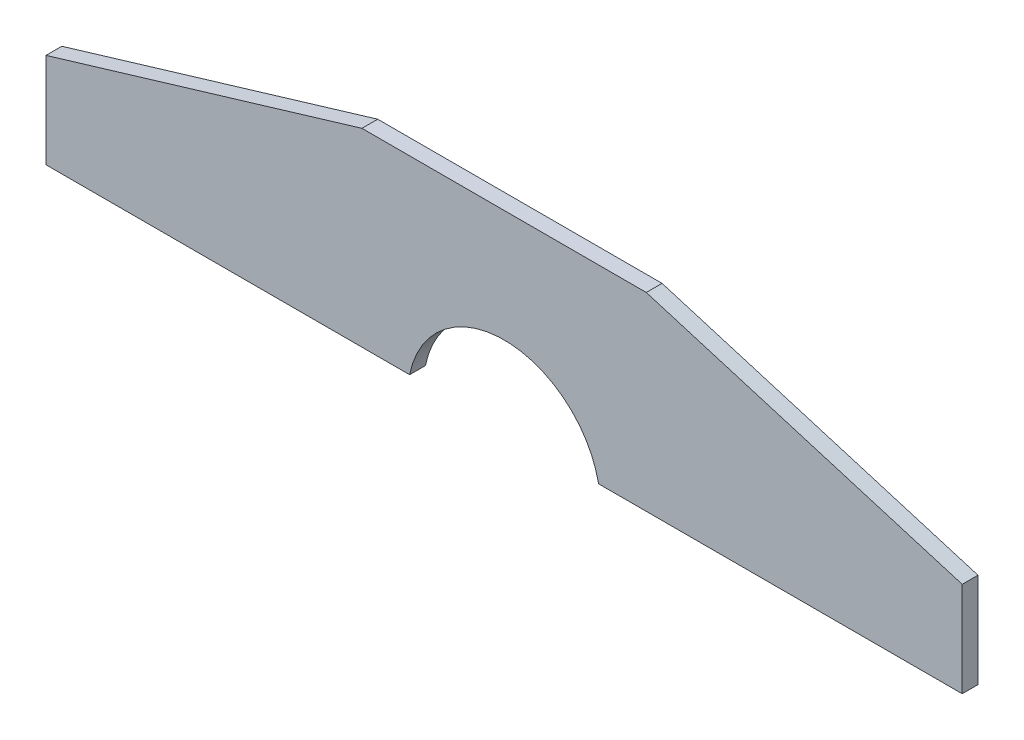
ISO-10303-21;
HEADER;
FILE_DESCRIPTION(('STEP AP214'),'2;1');
FILE_NAME('part.step','',(''),(''),'','','');
FILE_SCHEMA(('AUTOMOTIVE_DESIGN { 1 0 10303 214 1 1 1 1 }'));
ENDSEC;
DATA;
#1=APPLICATION_CONTEXT('core data for automotive mechanical design processes');
#2=APPLICATION_PROTOCOL_DEFINITION('international standard','automotive_design',2000,#1);
#3=PRODUCT_CONTEXT('',#1,'mechanical');
#4=PRODUCT('Part','Part','',(#3));
#5=PRODUCT_RELATED_PRODUCT_CATEGORY('part','',(#4));
#6=PRODUCT_DEFINITION_FORMATION('','',#4);
#7=PRODUCT_DEFINITION_CONTEXT('part definition',#1,'design');
#8=PRODUCT_DEFINITION('design','',#6,#7);
#9=PRODUCT_DEFINITION_SHAPE('','',#8);
#10=(LENGTH_UNIT() NAMED_UNIT(*) SI_UNIT(.MILLI.,.METRE.));
#11=(NAMED_UNIT(*) PLANE_ANGLE_UNIT() SI_UNIT($,.RADIAN.));
#12=(NAMED_UNIT(*) SI_UNIT($,.STERADIAN.) SOLID_ANGLE_UNIT());
#13=UNCERTAINTY_MEASURE_WITH_UNIT(LENGTH_MEASURE(1.E-05),#10,'distance_accuracy_value','');
#14=(GEOMETRIC_REPRESENTATION_CONTEXT(3) GLOBAL_UNCERTAINTY_ASSIGNED_CONTEXT((#13)) GLOBAL_UNIT_ASSIGNED_CONTEXT((#10,
#11,#12)) REPRESENTATION_CONTEXT('',''));
#15=CARTESIAN_POINT('',(0.,0.,0.));
#16=DIRECTION('',(0.,0.,1.));
#17=DIRECTION('',(1.,0.,0.));
#18=AXIS2_PLACEMENT_3D('',#15,#16,#17);
#19=CARTESIAN_POINT('',(-145.,6.,5.));
#20=DIRECTION('',(1.,0.,0.));
#21=DIRECTION('',(0.,0.,-1.));
#22=AXIS2_PLACEMENT_3D('',#19,#20,#21);
#23=PLANE('',#22);
#24=DIRECTION('',(0.,-1.,0.));
#25=VECTOR('',#24,1.);
#26=CARTESIAN_POINT('',(-145.,6.,0.));
#27=LINE('',#26,#25);
#28=CARTESIAN_POINT('',(-145.,36.,0.));
#29=VERTEX_POINT('',#28);
#30=CARTESIAN_POINT('',(-145.,6.,0.));
#31=VERTEX_POINT('',#30);
#32=EDGE_CURVE('E130',#29,#31,#27,.T.);
#33=ORIENTED_EDGE('',*,*,#32,.T.);
#34=DIRECTION('',(0.,0.,-1.));
#35=VECTOR('',#34,1.);
#36=CARTESIAN_POINT('',(-145.,6.,5.));
#37=LINE('',#36,#35);
#38=CARTESIAN_POINT('',(-145.,6.,5.));
#39=VERTEX_POINT('',#38);
#40=EDGE_CURVE('E11',#39,#31,#37,.T.);
#41=ORIENTED_EDGE('',*,*,#40,.F.);
#42=DIRECTION('',(0.,-1.,0.));
#43=VECTOR('',#42,1.);
#44=CARTESIAN_POINT('',(-145.,6.,5.));
#45=LINE('',#44,#43);
#46=CARTESIAN_POINT('',(-145.,36.,5.));
#47=VERTEX_POINT('',#46);
#48=EDGE_CURVE('E144',#47,#39,#45,.T.);
#49=ORIENTED_EDGE('',*,*,#48,.F.);
#50=DIRECTION('',(0.,0.,-1.));
#51=VECTOR('',#50,1.);
#52=CARTESIAN_POINT('',(-145.,36.,5.));
#53=LINE('',#52,#51);
#54=EDGE_CURVE('E126',#47,#29,#53,.T.);
#55=ORIENTED_EDGE('',*,*,#54,.T.);
#56=EDGE_LOOP('',(#33,#41,#49,#55));
#57=FACE_BOUND('',#56,.T.);
#58=ADVANCED_FACE('F34',(#57),#23,.F.);
#59=CARTESIAN_POINT('',(-145.,6.,5.));
#60=DIRECTION('',(0.,1.,0.));
#61=DIRECTION('',(0.,0.,1.));
#62=AXIS2_PLACEMENT_3D('',#59,#60,#61);
#63=PLANE('',#62);
#64=DIRECTION('',(1.,0.,0.));
#65=VECTOR('',#64,1.);
#66=CARTESIAN_POINT('',(-145.,6.,0.));
#67=LINE('',#66,#65);
#68=CARTESIAN_POINT('',(-29.9040131086114,6.,0.));
#69=VERTEX_POINT('',#68);
#70=EDGE_CURVE('E133',#31,#69,#67,.T.);
#71=ORIENTED_EDGE('',*,*,#70,.T.);
#72=DIRECTION('',(0.,0.,-1.));
#73=VECTOR('',#72,1.);
#74=CARTESIAN_POINT('',(-29.9040131086114,6.,5.));
#75=LINE('',#74,#73);
#76=CARTESIAN_POINT('',(-29.9040131086114,6.,5.));
#77=VERTEX_POINT('',#76);
#78=EDGE_CURVE('E42',#77,#69,#75,.T.);
#79=ORIENTED_EDGE('',*,*,#78,.F.);
#80=DIRECTION('',(1.,0.,0.));
#81=VECTOR('',#80,1.);
#82=CARTESIAN_POINT('',(-145.,6.,5.));
#83=LINE('',#82,#81);
#84=EDGE_CURVE('E93',#39,#77,#83,.T.);
#85=ORIENTED_EDGE('',*,*,#84,.F.);
#86=ORIENTED_EDGE('',*,*,#40,.T.);
#87=EDGE_LOOP('',(#71,#79,#85,#86));
#88=FACE_BOUND('',#87,.T.);
#89=ADVANCED_FACE('F179',(#88),#63,.F.);
#90=CARTESIAN_POINT('',(0.,0.,5.));
#91=DIRECTION('',(0.,0.,-1.));
#92=DIRECTION('',(-1.,0.,0.));
#93=AXIS2_PLACEMENT_3D('',#90,#91,#92);
#94=CYLINDRICAL_SURFACE('',#93,30.5);
#95=CARTESIAN_POINT('',(0.,0.,0.));
#96=DIRECTION('',(0.,0.,-1.));
#97=DIRECTION('',(1.,0.,0.));
#98=AXIS2_PLACEMENT_3D('',#95,#96,#97);
#99=CIRCLE('',#98,30.5);
#100=CARTESIAN_POINT('',(29.9040131086114,6.,0.));
#101=VERTEX_POINT('',#100);
#102=EDGE_CURVE('E135',#69,#101,#99,.T.);
#103=ORIENTED_EDGE('',*,*,#102,.T.);
#104=DIRECTION('',(0.,0.,-1.));
#105=VECTOR('',#104,1.);
#106=CARTESIAN_POINT('',(29.9040131086114,6.,5.));
#107=LINE('',#106,#105);
#108=CARTESIAN_POINT('',(29.9040131086114,6.,5.));
#109=VERTEX_POINT('',#108);
#110=EDGE_CURVE('E151',#109,#101,#107,.T.);
#111=ORIENTED_EDGE('',*,*,#110,.F.);
#112=CARTESIAN_POINT('',(0.,0.,5.));
#113=DIRECTION('',(0.,0.,-1.));
#114=DIRECTION('',(1.,0.,0.));
#115=AXIS2_PLACEMENT_3D('',#112,#113,#114);
#116=CIRCLE('',#115,30.5);
#117=EDGE_CURVE('E159',#77,#109,#116,.T.);
#118=ORIENTED_EDGE('',*,*,#117,.F.);
#119=ORIENTED_EDGE('',*,*,#78,.T.);
#120=EDGE_LOOP('',(#103,#111,#118,#119));
#121=FACE_BOUND('',#120,.T.);
#122=ADVANCED_FACE('F157',(#121),#94,.F.);
#123=CARTESIAN_POINT('',(29.9040131086114,6.,5.));
#124=DIRECTION('',(0.,1.,0.));
#125=DIRECTION('',(0.,0.,1.));
#126=AXIS2_PLACEMENT_3D('',#123,#124,#125);
#127=PLANE('',#126);
#128=DIRECTION('',(1.,0.,0.));
#129=VECTOR('',#128,1.);
#130=CARTESIAN_POINT('',(29.9040131086114,6.,0.));
#131=LINE('',#130,#129);
#132=CARTESIAN_POINT('',(145.,6.,0.));
#133=VERTEX_POINT('',#132);
#134=EDGE_CURVE('E137',#101,#133,#131,.T.);
#135=ORIENTED_EDGE('',*,*,#134,.T.);
#136=DIRECTION('',(0.,0.,-1.));
#137=VECTOR('',#136,1.);
#138=CARTESIAN_POINT('',(145.,6.,5.));
#139=LINE('',#138,#137);
#140=CARTESIAN_POINT('',(145.,6.,5.));
#141=VERTEX_POINT('',#140);
#142=EDGE_CURVE('E148',#141,#133,#139,.T.);
#143=ORIENTED_EDGE('',*,*,#142,.F.);
#144=DIRECTION('',(1.,0.,0.));
#145=VECTOR('',#144,1.);
#146=CARTESIAN_POINT('',(29.9040131086114,6.,5.));
#147=LINE('',#146,#145);
#148=EDGE_CURVE('E171',#109,#141,#147,.T.);
#149=ORIENTED_EDGE('',*,*,#148,.F.);
#150=ORIENTED_EDGE('',*,*,#110,.T.);
#151=EDGE_LOOP('',(#135,#143,#149,#150));
#152=FACE_BOUND('',#151,.T.);
#153=ADVANCED_FACE('F167',(#152),#127,.F.);
#154=CARTESIAN_POINT('',(145.,6.,5.));
#155=DIRECTION('',(-1.,0.,0.));
#156=DIRECTION('',(0.,0.,1.));
#157=AXIS2_PLACEMENT_3D('',#154,#155,#156);
#158=PLANE('',#157);
#159=DIRECTION('',(0.,1.,0.));
#160=VECTOR('',#159,1.);
#161=CARTESIAN_POINT('',(145.,6.,0.));
#162=LINE('',#161,#160);
#163=CARTESIAN_POINT('',(145.,36.,0.));
#164=VERTEX_POINT('',#163);
#165=EDGE_CURVE('E139',#133,#164,#162,.T.);
#166=ORIENTED_EDGE('',*,*,#165,.T.);
#167=DIRECTION('',(0.,0.,-1.));
#168=VECTOR('',#167,1.);
#169=CARTESIAN_POINT('',(145.,36.,5.));
#170=LINE('',#169,#168);
#171=CARTESIAN_POINT('',(145.,36.,5.));
#172=VERTEX_POINT('',#171);
#173=EDGE_CURVE('E121',#172,#164,#170,.T.);
#174=ORIENTED_EDGE('',*,*,#173,.F.);
#175=DIRECTION('',(0.,1.,0.));
#176=VECTOR('',#175,1.);
#177=CARTESIAN_POINT('',(145.,6.,5.));
#178=LINE('',#177,#176);
#179=EDGE_CURVE('E112',#141,#172,#178,.T.);
#180=ORIENTED_EDGE('',*,*,#179,.F.);
#181=ORIENTED_EDGE('',*,*,#142,.T.);
#182=EDGE_LOOP('',(#166,#174,#180,#181));
#183=FACE_BOUND('',#182,.T.);
#184=ADVANCED_FACE('F170',(#183),#158,.F.);
#185=CARTESIAN_POINT('',(45.,66.,5.));
#186=DIRECTION('',(-0.287347885566345,-0.957826285221151,0.));
#187=DIRECTION('',(0.957826285221151,-0.287347885566345,0.));
#188=AXIS2_PLACEMENT_3D('',#185,#186,#187);
#189=PLANE('',#188);
#190=DIRECTION('',(-0.957826285221151,0.287347885566345,0.));
#191=VECTOR('',#190,1.);
#192=CARTESIAN_POINT('',(45.,66.,0.));
#193=LINE('',#192,#191);
#194=CARTESIAN_POINT('',(45.,66.,0.));
#195=VERTEX_POINT('',#194);
#196=EDGE_CURVE('E120',#164,#195,#193,.T.);
#197=ORIENTED_EDGE('',*,*,#196,.T.);
#198=DIRECTION('',(0.,0.,-1.));
#199=VECTOR('',#198,1.);
#200=CARTESIAN_POINT('',(45.,66.,5.));
#201=LINE('',#200,#199);
#202=CARTESIAN_POINT('',(45.,66.,5.));
#203=VERTEX_POINT('',#202);
#204=EDGE_CURVE('E117',#203,#195,#201,.T.);
#205=ORIENTED_EDGE('',*,*,#204,.F.);
#206=DIRECTION('',(-0.957826285221151,0.287347885566345,0.));
#207=VECTOR('',#206,1.);
#208=CARTESIAN_POINT('',(45.,66.,5.));
#209=LINE('',#208,#207);
#210=EDGE_CURVE('E106',#172,#203,#209,.T.);
#211=ORIENTED_EDGE('',*,*,#210,.F.);
#212=ORIENTED_EDGE('',*,*,#173,.T.);
#213=EDGE_LOOP('',(#197,#205,#211,#212));
#214=FACE_BOUND('',#213,.T.);
#215=ADVANCED_FACE('F118',(#214),#189,.F.);
#216=CARTESIAN_POINT('',(-45.,66.,5.));
#217=DIRECTION('',(0.,-1.,0.));
#218=DIRECTION('',(0.,0.,-1.));
#219=AXIS2_PLACEMENT_3D('',#216,#217,#218);
#220=PLANE('',#219);
#221=DIRECTION('',(-1.,0.,0.));
#222=VECTOR('',#221,1.);
#223=CARTESIAN_POINT('',(-45.,66.,0.));
#224=LINE('',#223,#222);
#225=CARTESIAN_POINT('',(-45.,66.,0.));
#226=VERTEX_POINT('',#225);
#227=EDGE_CURVE('E79',#195,#226,#224,.T.);
#228=ORIENTED_EDGE('',*,*,#227,.T.);
#229=DIRECTION('',(0.,0.,-1.));
#230=VECTOR('',#229,1.);
#231=CARTESIAN_POINT('',(-45.,66.,5.));
#232=LINE('',#231,#230);
#233=CARTESIAN_POINT('',(-45.,66.,5.));
#234=VERTEX_POINT('',#233);
#235=EDGE_CURVE('E122',#234,#226,#232,.T.);
#236=ORIENTED_EDGE('',*,*,#235,.F.);
#237=DIRECTION('',(-1.,0.,0.));
#238=VECTOR('',#237,1.);
#239=CARTESIAN_POINT('',(-45.,66.,5.));
#240=LINE('',#239,#238);
#241=EDGE_CURVE('E110',#203,#234,#240,.T.);
#242=ORIENTED_EDGE('',*,*,#241,.F.);
#243=ORIENTED_EDGE('',*,*,#204,.T.);
#244=EDGE_LOOP('',(#228,#236,#242,#243));
#245=FACE_BOUND('',#244,.T.);
#246=ADVANCED_FACE('F124',(#245),#220,.F.);
#247=CARTESIAN_POINT('',(-145.,36.,5.));
#248=DIRECTION('',(0.287347885566345,-0.957826285221151,0.));
#249=DIRECTION('',(0.957826285221151,0.287347885566345,0.));
#250=AXIS2_PLACEMENT_3D('',#247,#248,#249);
#251=PLANE('',#250);
#252=DIRECTION('',(-0.957826285221151,-0.287347885566345,0.));
#253=VECTOR('',#252,1.);
#254=CARTESIAN_POINT('',(-145.,36.,0.));
#255=LINE('',#254,#253);
#256=EDGE_CURVE('E85',#226,#29,#255,.T.);
#257=ORIENTED_EDGE('',*,*,#256,.T.);
#258=ORIENTED_EDGE('',*,*,#54,.F.);
#259=DIRECTION('',(-0.957826285221151,-0.287347885566345,0.));
#260=VECTOR('',#259,1.);
#261=CARTESIAN_POINT('',(-145.,36.,5.));
#262=LINE('',#261,#260);
#263=EDGE_CURVE('E50',#234,#47,#262,.T.);
#264=ORIENTED_EDGE('',*,*,#263,.F.);
#265=ORIENTED_EDGE('',*,*,#235,.T.);
#266=EDGE_LOOP('',(#257,#258,#264,#265));
#267=FACE_BOUND('',#266,.T.);
#268=ADVANCED_FACE('F195',(#267),#251,.F.);
#269=CARTESIAN_POINT('',(0.,0.,5.));
#270=DIRECTION('',(0.,0.,1.));
#271=DIRECTION('',(1.,0.,0.));
#272=AXIS2_PLACEMENT_3D('',#269,#270,#271);
#273=PLANE('',#272);
#274=ORIENTED_EDGE('',*,*,#48,.T.);
#275=ORIENTED_EDGE('',*,*,#84,.T.);
#276=ORIENTED_EDGE('',*,*,#117,.T.);
#277=ORIENTED_EDGE('',*,*,#148,.T.);
#278=ORIENTED_EDGE('',*,*,#179,.T.);
#279=ORIENTED_EDGE('',*,*,#210,.T.);
#280=ORIENTED_EDGE('',*,*,#241,.T.);
#281=ORIENTED_EDGE('',*,*,#263,.T.);
#282=EDGE_LOOP('',(#274,#275,#276,#277,#278,#279,#280,#281));
#283=FACE_BOUND('',#282,.T.);
#284=ADVANCED_FACE('F108',(#283),#273,.T.);
#285=CARTESIAN_POINT('',(0.,0.,0.));
#286=DIRECTION('',(0.,0.,1.));
#287=DIRECTION('',(1.,0.,0.));
#288=AXIS2_PLACEMENT_3D('',#285,#286,#287);
#289=PLANE('',#288);
#290=ORIENTED_EDGE('',*,*,#32,.F.);
#291=ORIENTED_EDGE('',*,*,#256,.F.);
#292=ORIENTED_EDGE('',*,*,#227,.F.);
#293=ORIENTED_EDGE('',*,*,#196,.F.);
#294=ORIENTED_EDGE('',*,*,#165,.F.);
#295=ORIENTED_EDGE('',*,*,#134,.F.);
#296=ORIENTED_EDGE('',*,*,#102,.F.);
#297=ORIENTED_EDGE('',*,*,#70,.F.);
#298=EDGE_LOOP('',(#290,#291,#292,#293,#294,#295,#296,#297));
#299=FACE_BOUND('',#298,.T.);
#300=ADVANCED_FACE('F163',(#299),#289,.F.);
#301=CLOSED_SHELL('',(#58,#89,#122,#153,#184,#215,#246,#268,#284,#300));
#302=MANIFOLD_SOLID_BREP('B2',#301);
#303=ADVANCED_BREP_SHAPE_REPRESENTATION('',(#18,#302),#14);
#304=SHAPE_DEFINITION_REPRESENTATION(#9,#303);
ENDSEC;
END-ISO-10303-21;
